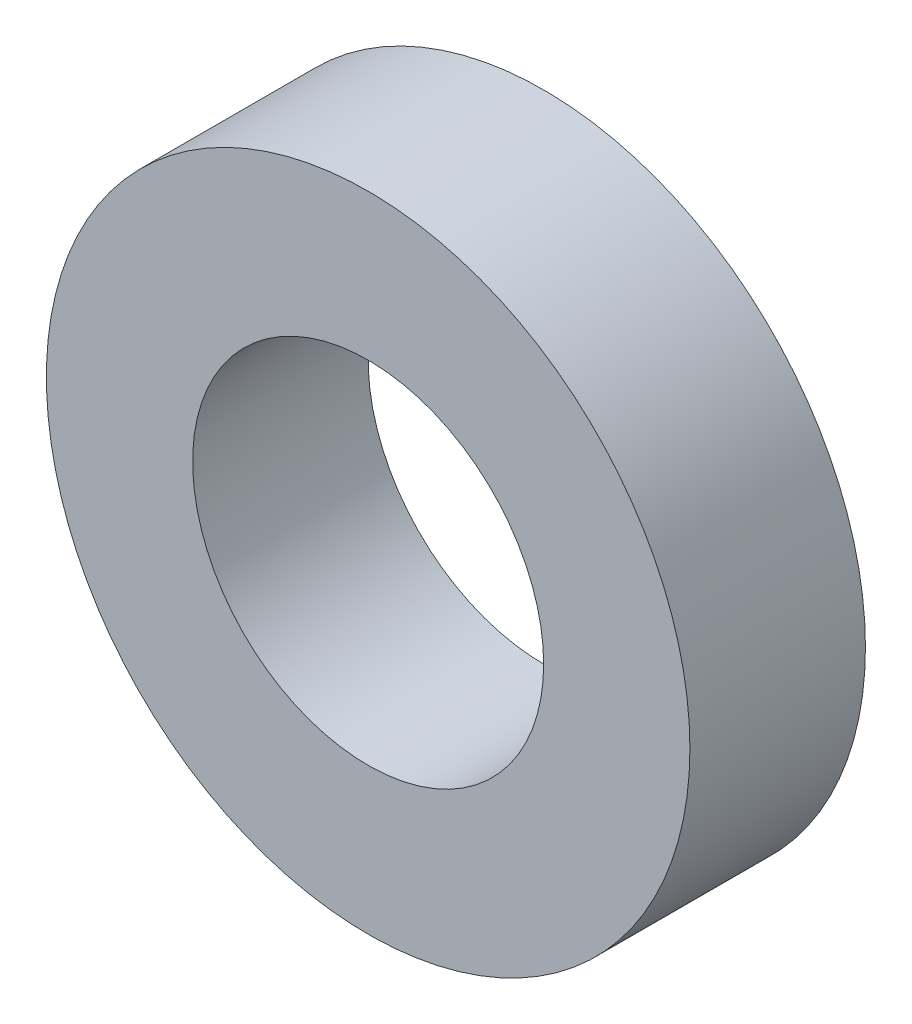
ISO-10303-21;
HEADER;
FILE_DESCRIPTION(('STEP AP214'),'2;1');
FILE_NAME('part.step','',(''),(''),'','','');
FILE_SCHEMA(('AUTOMOTIVE_DESIGN { 1 0 10303 214 1 1 1 1 }'));
ENDSEC;
DATA;
#1=APPLICATION_CONTEXT('core data for automotive mechanical design processes');
#2=APPLICATION_PROTOCOL_DEFINITION('international standard','automotive_design',2000,#1);
#3=PRODUCT_CONTEXT('',#1,'mechanical');
#4=PRODUCT('Part','Part','',(#3));
#5=PRODUCT_RELATED_PRODUCT_CATEGORY('part','',(#4));
#6=PRODUCT_DEFINITION_FORMATION('','',#4);
#7=PRODUCT_DEFINITION_CONTEXT('part definition',#1,'design');
#8=PRODUCT_DEFINITION('design','',#6,#7);
#9=PRODUCT_DEFINITION_SHAPE('','',#8);
#10=(LENGTH_UNIT() NAMED_UNIT(*) SI_UNIT(.MILLI.,.METRE.));
#11=(NAMED_UNIT(*) PLANE_ANGLE_UNIT() SI_UNIT($,.RADIAN.));
#12=(NAMED_UNIT(*) SI_UNIT($,.STERADIAN.) SOLID_ANGLE_UNIT());
#13=UNCERTAINTY_MEASURE_WITH_UNIT(LENGTH_MEASURE(1.E-05),#10,'distance_accuracy_value','');
#14=(GEOMETRIC_REPRESENTATION_CONTEXT(3) GLOBAL_UNCERTAINTY_ASSIGNED_CONTEXT((#13)) GLOBAL_UNIT_ASSIGNED_CONTEXT((#10,
#11,#12)) REPRESENTATION_CONTEXT('',''));
#15=CARTESIAN_POINT('',(0.,0.,0.));
#16=DIRECTION('',(0.,0.,1.));
#17=DIRECTION('',(1.,0.,0.));
#18=AXIS2_PLACEMENT_3D('',#15,#16,#17);
#19=CARTESIAN_POINT('',(0.,0.,1.5));
#20=DIRECTION('',(0.,0.,1.));
#21=DIRECTION('',(1.,0.,0.));
#22=AXIS2_PLACEMENT_3D('',#19,#20,#21);
#23=PLANE('',#22);
#24=CARTESIAN_POINT('',(0.,0.,1.5));
#25=DIRECTION('',(0.,0.,1.));
#26=DIRECTION('',(1.,0.,0.));
#27=AXIS2_PLACEMENT_3D('',#24,#25,#26);
#28=CIRCLE('',#27,2.75);
#29=CARTESIAN_POINT('',(2.75,0.,1.5));
#30=VERTEX_POINT('',#29);
#31=EDGE_CURVE('E10',#30,#30,#28,.T.);
#32=ORIENTED_EDGE('',*,*,#31,.T.);
#33=EDGE_LOOP('',(#32));
#34=FACE_BOUND('',#33,.T.);
#35=CARTESIAN_POINT('',(0.,0.,1.5));
#36=DIRECTION('',(0.,0.,1.));
#37=DIRECTION('',(1.,0.,0.));
#38=AXIS2_PLACEMENT_3D('',#35,#36,#37);
#39=CIRCLE('',#38,1.5);
#40=CARTESIAN_POINT('',(1.5,0.,1.5));
#41=VERTEX_POINT('',#40);
#42=EDGE_CURVE('E41',#41,#41,#39,.T.);
#43=ORIENTED_EDGE('',*,*,#42,.F.);
#44=EDGE_LOOP('',(#43));
#45=FACE_BOUND('',#44,.T.);
#46=ADVANCED_FACE('F30',(#34,#45),#23,.T.);
#47=CARTESIAN_POINT('',(0.,0.,0.));
#48=DIRECTION('',(0.,0.,1.));
#49=DIRECTION('',(1.,0.,0.));
#50=AXIS2_PLACEMENT_3D('',#47,#48,#49);
#51=PLANE('',#50);
#52=CARTESIAN_POINT('',(0.,0.,0.));
#53=DIRECTION('',(0.,0.,1.));
#54=DIRECTION('',(1.,0.,0.));
#55=AXIS2_PLACEMENT_3D('',#52,#53,#54);
#56=CIRCLE('',#55,2.75);
#57=CARTESIAN_POINT('',(2.75,0.,0.));
#58=VERTEX_POINT('',#57);
#59=EDGE_CURVE('E34',#58,#58,#56,.T.);
#60=ORIENTED_EDGE('',*,*,#59,.F.);
#61=EDGE_LOOP('',(#60));
#62=FACE_BOUND('',#61,.T.);
#63=CARTESIAN_POINT('',(0.,0.,0.));
#64=DIRECTION('',(0.,0.,1.));
#65=DIRECTION('',(1.,0.,0.));
#66=AXIS2_PLACEMENT_3D('',#63,#64,#65);
#67=CIRCLE('',#66,1.5);
#68=CARTESIAN_POINT('',(1.5,0.,0.));
#69=VERTEX_POINT('',#68);
#70=EDGE_CURVE('E43',#69,#69,#67,.T.);
#71=ORIENTED_EDGE('',*,*,#70,.T.);
#72=EDGE_LOOP('',(#71));
#73=FACE_BOUND('',#72,.T.);
#74=ADVANCED_FACE('F53',(#62,#73),#51,.F.);
#75=CARTESIAN_POINT('',(0.,0.,1.5));
#76=DIRECTION('',(0.,0.,-1.));
#77=DIRECTION('',(-1.,0.,0.));
#78=AXIS2_PLACEMENT_3D('',#75,#76,#77);
#79=CYLINDRICAL_SURFACE('',#78,2.75);
#80=ORIENTED_EDGE('',*,*,#31,.F.);
#81=EDGE_LOOP('',(#80));
#82=FACE_BOUND('',#81,.T.);
#83=ORIENTED_EDGE('',*,*,#59,.T.);
#84=EDGE_LOOP('',(#83));
#85=FACE_BOUND('',#84,.T.);
#86=ADVANCED_FACE('F32',(#82,#85),#79,.T.);
#87=CARTESIAN_POINT('',(0.,0.,1.5));
#88=DIRECTION('',(0.,0.,-1.));
#89=DIRECTION('',(-1.,0.,0.));
#90=AXIS2_PLACEMENT_3D('',#87,#88,#89);
#91=CYLINDRICAL_SURFACE('',#90,1.5);
#92=ORIENTED_EDGE('',*,*,#42,.T.);
#93=EDGE_LOOP('',(#92));
#94=FACE_BOUND('',#93,.T.);
#95=ORIENTED_EDGE('',*,*,#70,.F.);
#96=EDGE_LOOP('',(#95));
#97=FACE_BOUND('',#96,.T.);
#98=ADVANCED_FACE('F49',(#94,#97),#91,.F.);
#99=CLOSED_SHELL('',(#46,#74,#86,#98));
#100=MANIFOLD_SOLID_BREP('B2',#99);
#101=ADVANCED_BREP_SHAPE_REPRESENTATION('',(#18,#100),#14);
#102=SHAPE_DEFINITION_REPRESENTATION(#9,#101);
ENDSEC;
END-ISO-10303-21;
